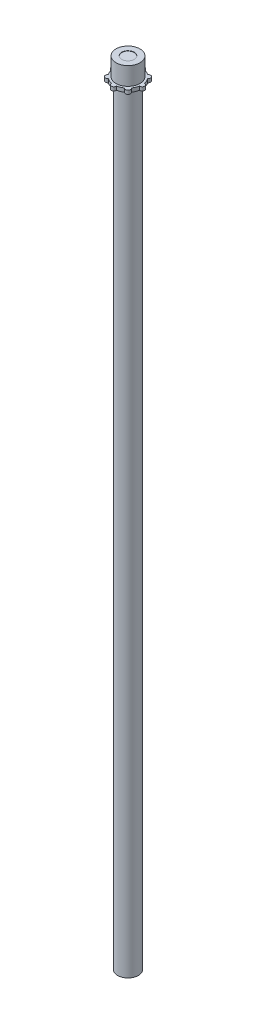
ISO-10303-21;
HEADER;
FILE_DESCRIPTION(('STEP AP214'),'2;1');
FILE_NAME('part.step','',(''),(''),'','','');
FILE_SCHEMA(('AUTOMOTIVE_DESIGN { 1 0 10303 214 1 1 1 1 }'));
ENDSEC;
DATA;
#1=APPLICATION_CONTEXT('core data for automotive mechanical design processes');
#2=APPLICATION_PROTOCOL_DEFINITION('international standard','automotive_design',2000,#1);
#3=PRODUCT_CONTEXT('',#1,'mechanical');
#4=PRODUCT('Part','Part','',(#3));
#5=PRODUCT_RELATED_PRODUCT_CATEGORY('part','',(#4));
#6=PRODUCT_DEFINITION_FORMATION('','',#4);
#7=PRODUCT_DEFINITION_CONTEXT('part definition',#1,'design');
#8=PRODUCT_DEFINITION('design','',#6,#7);
#9=PRODUCT_DEFINITION_SHAPE('','',#8);
#10=(LENGTH_UNIT() NAMED_UNIT(*) SI_UNIT(.MILLI.,.METRE.));
#11=(NAMED_UNIT(*) PLANE_ANGLE_UNIT() SI_UNIT($,.RADIAN.));
#12=(NAMED_UNIT(*) SI_UNIT($,.STERADIAN.) SOLID_ANGLE_UNIT());
#13=UNCERTAINTY_MEASURE_WITH_UNIT(LENGTH_MEASURE(1.E-05),#10,'distance_accuracy_value','');
#14=(GEOMETRIC_REPRESENTATION_CONTEXT(3) GLOBAL_UNCERTAINTY_ASSIGNED_CONTEXT((#13)) GLOBAL_UNIT_ASSIGNED_CONTEXT((#10,
#11,#12)) REPRESENTATION_CONTEXT('',''));
#15=CARTESIAN_POINT('',(0.,0.,0.));
#16=DIRECTION('',(0.,0.,1.));
#17=DIRECTION('',(1.,0.,0.));
#18=AXIS2_PLACEMENT_3D('',#15,#16,#17);
#19=CARTESIAN_POINT('',(0.,586.74,0.));
#20=DIRECTION('',(0.,-1.,0.));
#21=DIRECTION('',(0.,0.,-1.));
#22=AXIS2_PLACEMENT_3D('',#19,#20,#21);
#23=CYLINDRICAL_SURFACE('',#22,7.874);
#24=CARTESIAN_POINT('',(0.,586.74,0.));
#25=DIRECTION('',(0.,1.,0.));
#26=DIRECTION('',(0.,0.,1.));
#27=AXIS2_PLACEMENT_3D('',#24,#25,#26);
#28=CIRCLE('',#27,7.874);
#29=CARTESIAN_POINT('',(0.,586.74,7.874));
#30=VERTEX_POINT('',#29);
#31=EDGE_CURVE('E48',#30,#30,#28,.T.);
#32=ORIENTED_EDGE('',*,*,#31,.F.);
#33=EDGE_LOOP('',(#32));
#34=FACE_BOUND('',#33,.T.);
#35=CARTESIAN_POINT('',(0.,0.,0.));
#36=DIRECTION('',(0.,1.,0.));
#37=DIRECTION('',(0.,0.,1.));
#38=AXIS2_PLACEMENT_3D('',#35,#36,#37);
#39=CIRCLE('',#38,7.874);
#40=CARTESIAN_POINT('',(0.,0.,7.874));
#41=VERTEX_POINT('',#40);
#42=EDGE_CURVE('E41',#41,#41,#39,.T.);
#43=ORIENTED_EDGE('',*,*,#42,.T.);
#44=EDGE_LOOP('',(#43));
#45=FACE_BOUND('',#44,.T.);
#46=ADVANCED_FACE('F38',(#34,#45),#23,.T.);
#47=CARTESIAN_POINT('',(0.,0.,0.));
#48=DIRECTION('',(0.,1.,0.));
#49=DIRECTION('',(0.,0.,1.));
#50=AXIS2_PLACEMENT_3D('',#47,#48,#49);
#51=PLANE('',#50);
#52=ORIENTED_EDGE('',*,*,#42,.F.);
#53=EDGE_LOOP('',(#52));
#54=FACE_BOUND('',#53,.T.);
#55=ADVANCED_FACE('F299',(#54),#51,.F.);
#56=CARTESIAN_POINT('',(0.,589.534,0.));
#57=DIRECTION('',(0.,-1.,0.));
#58=DIRECTION('',(0.,0.,-1.));
#59=AXIS2_PLACEMENT_3D('',#56,#57,#58);
#60=CYLINDRICAL_SURFACE('',#59,10.795);
#61=CARTESIAN_POINT('',(0.,586.74,0.));
#62=DIRECTION('',(0.,1.,0.));
#63=DIRECTION('',(0.,0.,1.));
#64=AXIS2_PLACEMENT_3D('',#61,#62,#63);
#65=CIRCLE('',#64,10.795);
#66=CARTESIAN_POINT('',(-1.89756985251066,586.74,-10.6269117647058));
#67=VERTEX_POINT('',#66);
#68=CARTESIAN_POINT('',(-6.17257686140914,586.74,-8.85614588238002));
#69=VERTEX_POINT('',#68);
#70=EDGE_CURVE('E190',#67,#69,#65,.T.);
#71=ORIENTED_EDGE('',*,*,#70,.T.);
#72=DIRECTION('',(0.,-1.,0.));
#73=VECTOR('',#72,1.);
#74=CARTESIAN_POINT('',(-6.17257686140914,589.534,-8.85614588238002));
#75=LINE('',#74,#73);
#76=CARTESIAN_POINT('',(-6.17257686140914,589.534,-8.85614588238002));
#77=VERTEX_POINT('',#76);
#78=EDGE_CURVE('E288',#77,#69,#75,.T.);
#79=ORIENTED_EDGE('',*,*,#78,.F.);
#80=CARTESIAN_POINT('',(0.,589.534,0.));
#81=DIRECTION('',(0.,1.,0.));
#82=DIRECTION('',(0.,0.,1.));
#83=AXIS2_PLACEMENT_3D('',#80,#81,#82);
#84=CIRCLE('',#83,10.795);
#85=CARTESIAN_POINT('',(-1.89756985251066,589.534,-10.6269117647058));
#86=VERTEX_POINT('',#85);
#87=EDGE_CURVE('E237',#86,#77,#84,.T.);
#88=ORIENTED_EDGE('',*,*,#87,.F.);
#89=DIRECTION('',(0.,-1.,0.));
#90=VECTOR('',#89,1.);
#91=CARTESIAN_POINT('',(-1.89756985251066,589.534,-10.6269117647058));
#92=LINE('',#91,#90);
#93=EDGE_CURVE('E186',#86,#67,#92,.T.);
#94=ORIENTED_EDGE('',*,*,#93,.T.);
#95=EDGE_LOOP('',(#71,#79,#88,#94));
#96=FACE_BOUND('',#95,.T.);
#97=ADVANCED_FACE('F301',(#96),#60,.T.);
#98=CARTESIAN_POINT('',(-7.63321770290878,589.534,-7.63321770290878));
#99=DIRECTION('',(0.,-1.,0.));
#100=DIRECTION('',(0.,0.,-1.));
#101=AXIS2_PLACEMENT_3D('',#98,#99,#100);
#102=CYLINDRICAL_SURFACE('',#101,1.90500000000043);
#103=CARTESIAN_POINT('',(-7.63321770290878,586.74,-7.63321770290878));
#104=DIRECTION('',(0.,1.,0.));
#105=DIRECTION('',(0.,0.,1.));
#106=AXIS2_PLACEMENT_3D('',#103,#104,#105);
#107=CIRCLE('',#106,1.90500000000043);
#108=CARTESIAN_POINT('',(-8.85614588238002,586.74,-6.17257686140913));
#109=VERTEX_POINT('',#108);
#110=EDGE_CURVE('E194',#69,#109,#107,.T.);
#111=ORIENTED_EDGE('',*,*,#110,.T.);
#112=DIRECTION('',(0.,-1.,0.));
#113=VECTOR('',#112,1.);
#114=CARTESIAN_POINT('',(-8.85614588238002,589.534,-6.17257686140913));
#115=LINE('',#114,#113);
#116=CARTESIAN_POINT('',(-8.85614588238002,589.534,-6.17257686140913));
#117=VERTEX_POINT('',#116);
#118=EDGE_CURVE('E284',#117,#109,#115,.T.);
#119=ORIENTED_EDGE('',*,*,#118,.F.);
#120=CARTESIAN_POINT('',(-7.63321770290878,589.534,-7.63321770290878));
#121=DIRECTION('',(0.,1.,0.));
#122=DIRECTION('',(0.,0.,1.));
#123=AXIS2_PLACEMENT_3D('',#120,#121,#122);
#124=CIRCLE('',#123,1.90500000000043);
#125=EDGE_CURVE('E125',#77,#117,#124,.T.);
#126=ORIENTED_EDGE('',*,*,#125,.F.);
#127=ORIENTED_EDGE('',*,*,#78,.T.);
#128=EDGE_LOOP('',(#111,#119,#126,#127));
#129=FACE_BOUND('',#128,.T.);
#130=ADVANCED_FACE('F306',(#129),#102,.T.);
#131=CARTESIAN_POINT('',(0.,589.534,0.));
#132=DIRECTION('',(0.,-1.,0.));
#133=DIRECTION('',(0.,0.,-1.));
#134=AXIS2_PLACEMENT_3D('',#131,#132,#133);
#135=CYLINDRICAL_SURFACE('',#134,10.795);
#136=CARTESIAN_POINT('',(0.,586.74,0.));
#137=DIRECTION('',(0.,1.,0.));
#138=DIRECTION('',(0.,0.,1.));
#139=AXIS2_PLACEMENT_3D('',#136,#137,#138);
#140=CIRCLE('',#139,10.795);
#141=CARTESIAN_POINT('',(-10.6269117647058,586.74,-1.89756985251058));
#142=VERTEX_POINT('',#141);
#143=EDGE_CURVE('E198',#109,#142,#140,.T.);
#144=ORIENTED_EDGE('',*,*,#143,.T.);
#145=DIRECTION('',(0.,-1.,0.));
#146=VECTOR('',#145,1.);
#147=CARTESIAN_POINT('',(-10.6269117647058,589.534,-1.89756985251058));
#148=LINE('',#147,#146);
#149=CARTESIAN_POINT('',(-10.6269117647058,589.534,-1.89756985251058));
#150=VERTEX_POINT('',#149);
#151=EDGE_CURVE('E280',#150,#142,#148,.T.);
#152=ORIENTED_EDGE('',*,*,#151,.F.);
#153=CARTESIAN_POINT('',(0.,589.534,0.));
#154=DIRECTION('',(0.,1.,0.));
#155=DIRECTION('',(0.,0.,1.));
#156=AXIS2_PLACEMENT_3D('',#153,#154,#155);
#157=CIRCLE('',#156,10.795);
#158=EDGE_CURVE('E404',#117,#150,#157,.T.);
#159=ORIENTED_EDGE('',*,*,#158,.F.);
#160=ORIENTED_EDGE('',*,*,#118,.T.);
#161=EDGE_LOOP('',(#144,#152,#159,#160));
#162=FACE_BOUND('',#161,.T.);
#163=ADVANCED_FACE('F313',(#162),#135,.T.);
#164=CARTESIAN_POINT('',(-10.795,589.534,0.));
#165=DIRECTION('',(0.,-1.,0.));
#166=DIRECTION('',(0.,0.,-1.));
#167=AXIS2_PLACEMENT_3D('',#164,#165,#166);
#168=CYLINDRICAL_SURFACE('',#167,1.90500000000035);
#169=CARTESIAN_POINT('',(-10.795,586.74,0.));
#170=DIRECTION('',(0.,1.,0.));
#171=DIRECTION('',(0.,0.,1.));
#172=AXIS2_PLACEMENT_3D('',#169,#170,#171);
#173=CIRCLE('',#172,1.90500000000035);
#174=CARTESIAN_POINT('',(-10.6269117647058,586.74,1.89756985251067));
#175=VERTEX_POINT('',#174);
#176=EDGE_CURVE('E201',#142,#175,#173,.T.);
#177=ORIENTED_EDGE('',*,*,#176,.T.);
#178=DIRECTION('',(0.,-1.,0.));
#179=VECTOR('',#178,1.);
#180=CARTESIAN_POINT('',(-10.6269117647058,589.534,1.89756985251067));
#181=LINE('',#180,#179);
#182=CARTESIAN_POINT('',(-10.6269117647058,589.534,1.89756985251067));
#183=VERTEX_POINT('',#182);
#184=EDGE_CURVE('E276',#183,#175,#181,.T.);
#185=ORIENTED_EDGE('',*,*,#184,.F.);
#186=CARTESIAN_POINT('',(-10.795,589.534,0.));
#187=DIRECTION('',(0.,1.,0.));
#188=DIRECTION('',(0.,0.,1.));
#189=AXIS2_PLACEMENT_3D('',#186,#187,#188);
#190=CIRCLE('',#189,1.90500000000035);
#191=EDGE_CURVE('E407',#150,#183,#190,.T.);
#192=ORIENTED_EDGE('',*,*,#191,.F.);
#193=ORIENTED_EDGE('',*,*,#151,.T.);
#194=EDGE_LOOP('',(#177,#185,#192,#193));
#195=FACE_BOUND('',#194,.T.);
#196=ADVANCED_FACE('F316',(#195),#168,.T.);
#197=CARTESIAN_POINT('',(0.,589.534,0.));
#198=DIRECTION('',(0.,-1.,0.));
#199=DIRECTION('',(0.,0.,-1.));
#200=AXIS2_PLACEMENT_3D('',#197,#198,#199);
#201=CYLINDRICAL_SURFACE('',#200,10.795);
#202=CARTESIAN_POINT('',(0.,586.74,0.));
#203=DIRECTION('',(0.,1.,0.));
#204=DIRECTION('',(0.,0.,1.));
#205=AXIS2_PLACEMENT_3D('',#202,#203,#204);
#206=CIRCLE('',#205,10.795);
#207=CARTESIAN_POINT('',(-8.85614588237996,586.74,6.17257686140924));
#208=VERTEX_POINT('',#207);
#209=EDGE_CURVE('E204',#175,#208,#206,.T.);
#210=ORIENTED_EDGE('',*,*,#209,.T.);
#211=DIRECTION('',(0.,-1.,0.));
#212=VECTOR('',#211,1.);
#213=CARTESIAN_POINT('',(-8.85614588237996,589.534,6.17257686140924));
#214=LINE('',#213,#212);
#215=CARTESIAN_POINT('',(-8.85614588237996,589.534,6.17257686140924));
#216=VERTEX_POINT('',#215);
#217=EDGE_CURVE('E272',#216,#208,#214,.T.);
#218=ORIENTED_EDGE('',*,*,#217,.F.);
#219=CARTESIAN_POINT('',(0.,589.534,0.));
#220=DIRECTION('',(0.,1.,0.));
#221=DIRECTION('',(0.,0.,1.));
#222=AXIS2_PLACEMENT_3D('',#219,#220,#221);
#223=CIRCLE('',#222,10.795);
#224=EDGE_CURVE('E410',#183,#216,#223,.T.);
#225=ORIENTED_EDGE('',*,*,#224,.F.);
#226=ORIENTED_EDGE('',*,*,#184,.T.);
#227=EDGE_LOOP('',(#210,#218,#225,#226));
#228=FACE_BOUND('',#227,.T.);
#229=ADVANCED_FACE('F320',(#228),#201,.T.);
#230=CARTESIAN_POINT('',(-7.63321770290878,589.534,7.63321770290878));
#231=DIRECTION('',(0.,-1.,0.));
#232=DIRECTION('',(0.,0.,-1.));
#233=AXIS2_PLACEMENT_3D('',#230,#231,#232);
#234=CYLINDRICAL_SURFACE('',#233,1.90500000000031);
#235=CARTESIAN_POINT('',(-7.63321770290878,586.74,7.63321770290878));
#236=DIRECTION('',(0.,1.,0.));
#237=DIRECTION('',(0.,0.,1.));
#238=AXIS2_PLACEMENT_3D('',#235,#236,#237);
#239=CIRCLE('',#238,1.90500000000031);
#240=CARTESIAN_POINT('',(-6.17257686140913,586.74,8.85614588238002));
#241=VERTEX_POINT('',#240);
#242=EDGE_CURVE('E207',#208,#241,#239,.T.);
#243=ORIENTED_EDGE('',*,*,#242,.T.);
#244=DIRECTION('',(0.,-1.,0.));
#245=VECTOR('',#244,1.);
#246=CARTESIAN_POINT('',(-6.17257686140913,589.534,8.85614588238002));
#247=LINE('',#246,#245);
#248=CARTESIAN_POINT('',(-6.17257686140913,589.534,8.85614588238002));
#249=VERTEX_POINT('',#248);
#250=EDGE_CURVE('E268',#249,#241,#247,.T.);
#251=ORIENTED_EDGE('',*,*,#250,.F.);
#252=CARTESIAN_POINT('',(-7.63321770290878,589.534,7.63321770290878));
#253=DIRECTION('',(0.,1.,0.));
#254=DIRECTION('',(0.,0.,1.));
#255=AXIS2_PLACEMENT_3D('',#252,#253,#254);
#256=CIRCLE('',#255,1.90500000000031);
#257=EDGE_CURVE('E413',#216,#249,#256,.T.);
#258=ORIENTED_EDGE('',*,*,#257,.F.);
#259=ORIENTED_EDGE('',*,*,#217,.T.);
#260=EDGE_LOOP('',(#243,#251,#258,#259));
#261=FACE_BOUND('',#260,.T.);
#262=ADVANCED_FACE('F324',(#261),#234,.T.);
#263=CARTESIAN_POINT('',(0.,589.534,0.));
#264=DIRECTION('',(0.,-1.,0.));
#265=DIRECTION('',(0.,0.,-1.));
#266=AXIS2_PLACEMENT_3D('',#263,#264,#265);
#267=CYLINDRICAL_SURFACE('',#266,10.795);
#268=CARTESIAN_POINT('',(0.,586.74,0.));
#269=DIRECTION('',(0.,1.,0.));
#270=DIRECTION('',(0.,0.,1.));
#271=AXIS2_PLACEMENT_3D('',#268,#269,#270);
#272=CIRCLE('',#271,10.795);
#273=CARTESIAN_POINT('',(-1.89756985251066,586.74,10.6269117647058));
#274=VERTEX_POINT('',#273);
#275=EDGE_CURVE('E210',#241,#274,#272,.T.);
#276=ORIENTED_EDGE('',*,*,#275,.T.);
#277=DIRECTION('',(0.,-1.,0.));
#278=VECTOR('',#277,1.);
#279=CARTESIAN_POINT('',(-1.89756985251066,589.534,10.6269117647058));
#280=LINE('',#279,#278);
#281=CARTESIAN_POINT('',(-1.89756985251066,589.534,10.6269117647058));
#282=VERTEX_POINT('',#281);
#283=EDGE_CURVE('E264',#282,#274,#280,.T.);
#284=ORIENTED_EDGE('',*,*,#283,.F.);
#285=CARTESIAN_POINT('',(0.,589.534,0.));
#286=DIRECTION('',(0.,1.,0.));
#287=DIRECTION('',(0.,0.,1.));
#288=AXIS2_PLACEMENT_3D('',#285,#286,#287);
#289=CIRCLE('',#288,10.795);
#290=EDGE_CURVE('E416',#249,#282,#289,.T.);
#291=ORIENTED_EDGE('',*,*,#290,.F.);
#292=ORIENTED_EDGE('',*,*,#250,.T.);
#293=EDGE_LOOP('',(#276,#284,#291,#292));
#294=FACE_BOUND('',#293,.T.);
#295=ADVANCED_FACE('F328',(#294),#267,.T.);
#296=CARTESIAN_POINT('',(0.,589.534,10.795));
#297=DIRECTION('',(0.,-1.,0.));
#298=DIRECTION('',(0.,0.,-1.));
#299=AXIS2_PLACEMENT_3D('',#296,#297,#298);
#300=CYLINDRICAL_SURFACE('',#299,1.90500000000043);
#301=CARTESIAN_POINT('',(0.,586.74,10.795));
#302=DIRECTION('',(0.,1.,0.));
#303=DIRECTION('',(0.,0.,1.));
#304=AXIS2_PLACEMENT_3D('',#301,#302,#303);
#305=CIRCLE('',#304,1.90500000000043);
#306=CARTESIAN_POINT('',(1.89756985251066,586.74,10.6269117647058));
#307=VERTEX_POINT('',#306);
#308=EDGE_CURVE('E213',#274,#307,#305,.T.);
#309=ORIENTED_EDGE('',*,*,#308,.T.);
#310=DIRECTION('',(0.,-1.,0.));
#311=VECTOR('',#310,1.);
#312=CARTESIAN_POINT('',(1.89756985251066,589.534,10.6269117647058));
#313=LINE('',#312,#311);
#314=CARTESIAN_POINT('',(1.89756985251066,589.534,10.6269117647058));
#315=VERTEX_POINT('',#314);
#316=EDGE_CURVE('E260',#315,#307,#313,.T.);
#317=ORIENTED_EDGE('',*,*,#316,.F.);
#318=CARTESIAN_POINT('',(0.,589.534,10.795));
#319=DIRECTION('',(0.,1.,0.));
#320=DIRECTION('',(0.,0.,1.));
#321=AXIS2_PLACEMENT_3D('',#318,#319,#320);
#322=CIRCLE('',#321,1.90500000000043);
#323=EDGE_CURVE('E419',#282,#315,#322,.T.);
#324=ORIENTED_EDGE('',*,*,#323,.F.);
#325=ORIENTED_EDGE('',*,*,#283,.T.);
#326=EDGE_LOOP('',(#309,#317,#324,#325));
#327=FACE_BOUND('',#326,.T.);
#328=ADVANCED_FACE('F332',(#327),#300,.T.);
#329=CARTESIAN_POINT('',(0.,589.534,0.));
#330=DIRECTION('',(0.,-1.,0.));
#331=DIRECTION('',(0.,0.,-1.));
#332=AXIS2_PLACEMENT_3D('',#329,#330,#331);
#333=CYLINDRICAL_SURFACE('',#332,10.795);
#334=CARTESIAN_POINT('',(0.,586.74,0.));
#335=DIRECTION('',(0.,1.,0.));
#336=DIRECTION('',(0.,0.,1.));
#337=AXIS2_PLACEMENT_3D('',#334,#335,#336);
#338=CIRCLE('',#337,10.795);
#339=CARTESIAN_POINT('',(6.17257686140913,586.74,8.85614588238002));
#340=VERTEX_POINT('',#339);
#341=EDGE_CURVE('E216',#307,#340,#338,.T.);
#342=ORIENTED_EDGE('',*,*,#341,.T.);
#343=DIRECTION('',(0.,-1.,0.));
#344=VECTOR('',#343,1.);
#345=CARTESIAN_POINT('',(6.17257686140913,589.534,8.85614588238002));
#346=LINE('',#345,#344);
#347=CARTESIAN_POINT('',(6.17257686140913,589.534,8.85614588238002));
#348=VERTEX_POINT('',#347);
#349=EDGE_CURVE('E256',#348,#340,#346,.T.);
#350=ORIENTED_EDGE('',*,*,#349,.F.);
#351=CARTESIAN_POINT('',(0.,589.534,0.));
#352=DIRECTION('',(0.,1.,0.));
#353=DIRECTION('',(0.,0.,1.));
#354=AXIS2_PLACEMENT_3D('',#351,#352,#353);
#355=CIRCLE('',#354,10.795);
#356=EDGE_CURVE('E422',#315,#348,#355,.T.);
#357=ORIENTED_EDGE('',*,*,#356,.F.);
#358=ORIENTED_EDGE('',*,*,#316,.T.);
#359=EDGE_LOOP('',(#342,#350,#357,#358));
#360=FACE_BOUND('',#359,.T.);
#361=ADVANCED_FACE('F336',(#360),#333,.T.);
#362=CARTESIAN_POINT('',(7.63321770290878,589.534,7.63321770290878));
#363=DIRECTION('',(0.,-1.,0.));
#364=DIRECTION('',(0.,0.,-1.));
#365=AXIS2_PLACEMENT_3D('',#362,#363,#364);
#366=CYLINDRICAL_SURFACE('',#365,1.90500000000043);
#367=CARTESIAN_POINT('',(7.63321770290878,586.74,7.63321770290878));
#368=DIRECTION('',(0.,1.,0.));
#369=DIRECTION('',(0.,0.,1.));
#370=AXIS2_PLACEMENT_3D('',#367,#368,#369);
#371=CIRCLE('',#370,1.90500000000043);
#372=CARTESIAN_POINT('',(8.85614588238002,586.74,6.17257686140914));
#373=VERTEX_POINT('',#372);
#374=EDGE_CURVE('E219',#340,#373,#371,.T.);
#375=ORIENTED_EDGE('',*,*,#374,.T.);
#376=DIRECTION('',(0.,-1.,0.));
#377=VECTOR('',#376,1.);
#378=CARTESIAN_POINT('',(8.85614588238002,589.534,6.17257686140914));
#379=LINE('',#378,#377);
#380=CARTESIAN_POINT('',(8.85614588238002,589.534,6.17257686140914));
#381=VERTEX_POINT('',#380);
#382=EDGE_CURVE('E252',#381,#373,#379,.T.);
#383=ORIENTED_EDGE('',*,*,#382,.F.);
#384=CARTESIAN_POINT('',(7.63321770290878,589.534,7.63321770290878));
#385=DIRECTION('',(0.,1.,0.));
#386=DIRECTION('',(0.,0.,1.));
#387=AXIS2_PLACEMENT_3D('',#384,#385,#386);
#388=CIRCLE('',#387,1.90500000000043);
#389=EDGE_CURVE('E425',#348,#381,#388,.T.);
#390=ORIENTED_EDGE('',*,*,#389,.F.);
#391=ORIENTED_EDGE('',*,*,#349,.T.);
#392=EDGE_LOOP('',(#375,#383,#390,#391));
#393=FACE_BOUND('',#392,.T.);
#394=ADVANCED_FACE('F340',(#393),#366,.T.);
#395=CARTESIAN_POINT('',(0.,589.534,0.));
#396=DIRECTION('',(0.,-1.,0.));
#397=DIRECTION('',(0.,0.,-1.));
#398=AXIS2_PLACEMENT_3D('',#395,#396,#397);
#399=CYLINDRICAL_SURFACE('',#398,10.795);
#400=CARTESIAN_POINT('',(0.,586.74,0.));
#401=DIRECTION('',(0.,1.,0.));
#402=DIRECTION('',(0.,0.,1.));
#403=AXIS2_PLACEMENT_3D('',#400,#401,#402);
#404=CIRCLE('',#403,10.795);
#405=CARTESIAN_POINT('',(10.6269117647058,586.74,1.89756985251066));
#406=VERTEX_POINT('',#405);
#407=EDGE_CURVE('E222',#373,#406,#404,.T.);
#408=ORIENTED_EDGE('',*,*,#407,.T.);
#409=DIRECTION('',(0.,-1.,0.));
#410=VECTOR('',#409,1.);
#411=CARTESIAN_POINT('',(10.6269117647058,589.534,1.89756985251066));
#412=LINE('',#411,#410);
#413=CARTESIAN_POINT('',(10.6269117647058,589.534,1.89756985251066));
#414=VERTEX_POINT('',#413);
#415=EDGE_CURVE('E248',#414,#406,#412,.T.);
#416=ORIENTED_EDGE('',*,*,#415,.F.);
#417=CARTESIAN_POINT('',(0.,589.534,0.));
#418=DIRECTION('',(0.,1.,0.));
#419=DIRECTION('',(0.,0.,1.));
#420=AXIS2_PLACEMENT_3D('',#417,#418,#419);
#421=CIRCLE('',#420,10.795);
#422=EDGE_CURVE('E428',#381,#414,#421,.T.);
#423=ORIENTED_EDGE('',*,*,#422,.F.);
#424=ORIENTED_EDGE('',*,*,#382,.T.);
#425=EDGE_LOOP('',(#408,#416,#423,#424));
#426=FACE_BOUND('',#425,.T.);
#427=ADVANCED_FACE('F344',(#426),#399,.T.);
#428=CARTESIAN_POINT('',(10.795,589.534,0.));
#429=DIRECTION('',(0.,-1.,0.));
#430=DIRECTION('',(0.,0.,-1.));
#431=AXIS2_PLACEMENT_3D('',#428,#429,#430);
#432=CYLINDRICAL_SURFACE('',#431,1.90500000000044);
#433=CARTESIAN_POINT('',(10.795,586.74,0.));
#434=DIRECTION('',(0.,1.,0.));
#435=DIRECTION('',(0.,0.,1.));
#436=AXIS2_PLACEMENT_3D('',#433,#434,#435);
#437=CIRCLE('',#436,1.90500000000044);
#438=CARTESIAN_POINT('',(10.6269117647058,586.74,-1.89756985251067));
#439=VERTEX_POINT('',#438);
#440=EDGE_CURVE('E225',#406,#439,#437,.T.);
#441=ORIENTED_EDGE('',*,*,#440,.T.);
#442=DIRECTION('',(0.,-1.,0.));
#443=VECTOR('',#442,1.);
#444=CARTESIAN_POINT('',(10.6269117647058,589.534,-1.89756985251067));
#445=LINE('',#444,#443);
#446=CARTESIAN_POINT('',(10.6269117647058,589.534,-1.89756985251067));
#447=VERTEX_POINT('',#446);
#448=EDGE_CURVE('E244',#447,#439,#445,.T.);
#449=ORIENTED_EDGE('',*,*,#448,.F.);
#450=CARTESIAN_POINT('',(10.795,589.534,0.));
#451=DIRECTION('',(0.,1.,0.));
#452=DIRECTION('',(0.,0.,1.));
#453=AXIS2_PLACEMENT_3D('',#450,#451,#452);
#454=CIRCLE('',#453,1.90500000000044);
#455=EDGE_CURVE('E431',#414,#447,#454,.T.);
#456=ORIENTED_EDGE('',*,*,#455,.F.);
#457=ORIENTED_EDGE('',*,*,#415,.T.);
#458=EDGE_LOOP('',(#441,#449,#456,#457));
#459=FACE_BOUND('',#458,.T.);
#460=ADVANCED_FACE('F348',(#459),#432,.T.);
#461=CARTESIAN_POINT('',(0.,589.534,0.));
#462=DIRECTION('',(0.,-1.,0.));
#463=DIRECTION('',(0.,0.,-1.));
#464=AXIS2_PLACEMENT_3D('',#461,#462,#463);
#465=CYLINDRICAL_SURFACE('',#464,10.795);
#466=CARTESIAN_POINT('',(0.,586.74,0.));
#467=DIRECTION('',(0.,1.,0.));
#468=DIRECTION('',(0.,0.,1.));
#469=AXIS2_PLACEMENT_3D('',#466,#467,#468);
#470=CIRCLE('',#469,10.795);
#471=CARTESIAN_POINT('',(8.85614588238002,586.74,-6.17257686140914));
#472=VERTEX_POINT('',#471);
#473=EDGE_CURVE('E228',#439,#472,#470,.T.);
#474=ORIENTED_EDGE('',*,*,#473,.T.);
#475=DIRECTION('',(0.,-1.,0.));
#476=VECTOR('',#475,1.);
#477=CARTESIAN_POINT('',(8.85614588238002,589.534,-6.17257686140914));
#478=LINE('',#477,#476);
#479=CARTESIAN_POINT('',(8.85614588238002,589.534,-6.17257686140914));
#480=VERTEX_POINT('',#479);
#481=EDGE_CURVE('E179',#480,#472,#478,.T.);
#482=ORIENTED_EDGE('',*,*,#481,.F.);
#483=CARTESIAN_POINT('',(0.,589.534,0.));
#484=DIRECTION('',(0.,1.,0.));
#485=DIRECTION('',(0.,0.,1.));
#486=AXIS2_PLACEMENT_3D('',#483,#484,#485);
#487=CIRCLE('',#486,10.795);
#488=EDGE_CURVE('E168',#447,#480,#487,.T.);
#489=ORIENTED_EDGE('',*,*,#488,.F.);
#490=ORIENTED_EDGE('',*,*,#448,.T.);
#491=EDGE_LOOP('',(#474,#482,#489,#490));
#492=FACE_BOUND('',#491,.T.);
#493=ADVANCED_FACE('F352',(#492),#465,.T.);
#494=CARTESIAN_POINT('',(7.63321770290878,589.534,-7.63321770290878));
#495=DIRECTION('',(0.,-1.,0.));
#496=DIRECTION('',(0.,0.,-1.));
#497=AXIS2_PLACEMENT_3D('',#494,#495,#496);
#498=CYLINDRICAL_SURFACE('',#497,1.90500000000043);
#499=CARTESIAN_POINT('',(7.63321770290878,586.74,-7.63321770290878));
#500=DIRECTION('',(0.,1.,0.));
#501=DIRECTION('',(0.,0.,1.));
#502=AXIS2_PLACEMENT_3D('',#499,#500,#501);
#503=CIRCLE('',#502,1.90500000000043);
#504=CARTESIAN_POINT('',(6.17257686140913,586.74,-8.85614588238002));
#505=VERTEX_POINT('',#504);
#506=EDGE_CURVE('E177',#472,#505,#503,.T.);
#507=ORIENTED_EDGE('',*,*,#506,.T.);
#508=DIRECTION('',(0.,-1.,0.));
#509=VECTOR('',#508,1.);
#510=CARTESIAN_POINT('',(6.17257686140913,589.534,-8.85614588238002));
#511=LINE('',#510,#509);
#512=CARTESIAN_POINT('',(6.17257686140913,589.534,-8.85614588238002));
#513=VERTEX_POINT('',#512);
#514=EDGE_CURVE('E174',#513,#505,#511,.T.);
#515=ORIENTED_EDGE('',*,*,#514,.F.);
#516=CARTESIAN_POINT('',(7.63321770290878,589.534,-7.63321770290878));
#517=DIRECTION('',(0.,1.,0.));
#518=DIRECTION('',(0.,0.,1.));
#519=AXIS2_PLACEMENT_3D('',#516,#517,#518);
#520=CIRCLE('',#519,1.90500000000043);
#521=EDGE_CURVE('E162',#480,#513,#520,.T.);
#522=ORIENTED_EDGE('',*,*,#521,.F.);
#523=ORIENTED_EDGE('',*,*,#481,.T.);
#524=EDGE_LOOP('',(#507,#515,#522,#523));
#525=FACE_BOUND('',#524,.T.);
#526=ADVANCED_FACE('F175',(#525),#498,.T.);
#527=CARTESIAN_POINT('',(0.,589.534,0.));
#528=DIRECTION('',(0.,-1.,0.));
#529=DIRECTION('',(0.,0.,-1.));
#530=AXIS2_PLACEMENT_3D('',#527,#528,#529);
#531=CYLINDRICAL_SURFACE('',#530,10.795);
#532=CARTESIAN_POINT('',(0.,586.74,0.));
#533=DIRECTION('',(0.,1.,0.));
#534=DIRECTION('',(0.,0.,1.));
#535=AXIS2_PLACEMENT_3D('',#532,#533,#534);
#536=CIRCLE('',#535,10.795);
#537=CARTESIAN_POINT('',(1.89756985251066,586.74,-10.6269117647058));
#538=VERTEX_POINT('',#537);
#539=EDGE_CURVE('E110',#505,#538,#536,.T.);
#540=ORIENTED_EDGE('',*,*,#539,.T.);
#541=DIRECTION('',(0.,-1.,0.));
#542=VECTOR('',#541,1.);
#543=CARTESIAN_POINT('',(1.89756985251066,589.534,-10.6269117647058));
#544=LINE('',#543,#542);
#545=CARTESIAN_POINT('',(1.89756985251066,589.534,-10.6269117647058));
#546=VERTEX_POINT('',#545);
#547=EDGE_CURVE('E180',#546,#538,#544,.T.);
#548=ORIENTED_EDGE('',*,*,#547,.F.);
#549=CARTESIAN_POINT('',(0.,589.534,0.));
#550=DIRECTION('',(0.,1.,0.));
#551=DIRECTION('',(0.,0.,1.));
#552=AXIS2_PLACEMENT_3D('',#549,#550,#551);
#553=CIRCLE('',#552,10.795);
#554=EDGE_CURVE('E166',#513,#546,#553,.T.);
#555=ORIENTED_EDGE('',*,*,#554,.F.);
#556=ORIENTED_EDGE('',*,*,#514,.T.);
#557=EDGE_LOOP('',(#540,#548,#555,#556));
#558=FACE_BOUND('',#557,.T.);
#559=ADVANCED_FACE('F182',(#558),#531,.T.);
#560=CARTESIAN_POINT('',(0.,589.534,-10.795));
#561=DIRECTION('',(0.,-1.,0.));
#562=DIRECTION('',(0.,0.,-1.));
#563=AXIS2_PLACEMENT_3D('',#560,#561,#562);
#564=CYLINDRICAL_SURFACE('',#563,1.90500000000043);
#565=CARTESIAN_POINT('',(0.,586.74,-10.795));
#566=DIRECTION('',(0.,1.,0.));
#567=DIRECTION('',(0.,0.,1.));
#568=AXIS2_PLACEMENT_3D('',#565,#566,#567);
#569=CIRCLE('',#568,1.90500000000043);
#570=EDGE_CURVE('E116',#538,#67,#569,.T.);
#571=ORIENTED_EDGE('',*,*,#570,.T.);
#572=ORIENTED_EDGE('',*,*,#93,.F.);
#573=CARTESIAN_POINT('',(0.,589.534,-10.795));
#574=DIRECTION('',(0.,1.,0.));
#575=DIRECTION('',(0.,0.,1.));
#576=AXIS2_PLACEMENT_3D('',#573,#574,#575);
#577=CIRCLE('',#576,1.90500000000043);
#578=EDGE_CURVE('E57',#546,#86,#577,.T.);
#579=ORIENTED_EDGE('',*,*,#578,.F.);
#580=ORIENTED_EDGE('',*,*,#547,.T.);
#581=EDGE_LOOP('',(#571,#572,#579,#580));
#582=FACE_BOUND('',#581,.T.);
#583=ADVANCED_FACE('F361',(#582),#564,.T.);
#584=CARTESIAN_POINT('',(-3.81660885145439,589.534,-3.81660885145439));
#585=DIRECTION('',(0.,1.,0.));
#586=DIRECTION('',(0.,0.,1.));
#587=AXIS2_PLACEMENT_3D('',#584,#585,#586);
#588=PLANE('',#587);
#589=CARTESIAN_POINT('',(0.,589.534,0.));
#590=DIRECTION('',(0.,1.,0.));
#591=DIRECTION('',(0.,0.,1.));
#592=AXIS2_PLACEMENT_3D('',#589,#590,#591);
#593=CIRCLE('',#592,9.144);
#594=CARTESIAN_POINT('',(0.,589.534,9.144));
#595=VERTEX_POINT('',#594);
#596=EDGE_CURVE('E11',#595,#595,#593,.T.);
#597=ORIENTED_EDGE('',*,*,#596,.F.);
#598=EDGE_LOOP('',(#597));
#599=FACE_BOUND('',#598,.T.);
#600=ORIENTED_EDGE('',*,*,#87,.T.);
#601=ORIENTED_EDGE('',*,*,#125,.T.);
#602=ORIENTED_EDGE('',*,*,#158,.T.);
#603=ORIENTED_EDGE('',*,*,#191,.T.);
#604=ORIENTED_EDGE('',*,*,#224,.T.);
#605=ORIENTED_EDGE('',*,*,#257,.T.);
#606=ORIENTED_EDGE('',*,*,#290,.T.);
#607=ORIENTED_EDGE('',*,*,#323,.T.);
#608=ORIENTED_EDGE('',*,*,#356,.T.);
#609=ORIENTED_EDGE('',*,*,#389,.T.);
#610=ORIENTED_EDGE('',*,*,#422,.T.);
#611=ORIENTED_EDGE('',*,*,#455,.T.);
#612=ORIENTED_EDGE('',*,*,#488,.T.);
#613=ORIENTED_EDGE('',*,*,#521,.T.);
#614=ORIENTED_EDGE('',*,*,#554,.T.);
#615=ORIENTED_EDGE('',*,*,#578,.T.);
#616=EDGE_LOOP('',(#600,#601,#602,#603,#604,#605,#606,#607,#608,#609,#610,#611,#612,#613,#614,#615));
#617=FACE_BOUND('',#616,.T.);
#618=ADVANCED_FACE('F164',(#599,#617),#588,.T.);
#619=CARTESIAN_POINT('',(-3.81660885145439,586.74,-3.81660885145439));
#620=DIRECTION('',(0.,1.,0.));
#621=DIRECTION('',(0.,0.,1.));
#622=AXIS2_PLACEMENT_3D('',#619,#620,#621);
#623=PLANE('',#622);
#624=ORIENTED_EDGE('',*,*,#31,.T.);
#625=EDGE_LOOP('',(#624));
#626=FACE_BOUND('',#625,.T.);
#627=ORIENTED_EDGE('',*,*,#70,.F.);
#628=ORIENTED_EDGE('',*,*,#570,.F.);
#629=ORIENTED_EDGE('',*,*,#539,.F.);
#630=ORIENTED_EDGE('',*,*,#506,.F.);
#631=ORIENTED_EDGE('',*,*,#473,.F.);
#632=ORIENTED_EDGE('',*,*,#440,.F.);
#633=ORIENTED_EDGE('',*,*,#407,.F.);
#634=ORIENTED_EDGE('',*,*,#374,.F.);
#635=ORIENTED_EDGE('',*,*,#341,.F.);
#636=ORIENTED_EDGE('',*,*,#308,.F.);
#637=ORIENTED_EDGE('',*,*,#275,.F.);
#638=ORIENTED_EDGE('',*,*,#242,.F.);
#639=ORIENTED_EDGE('',*,*,#209,.F.);
#640=ORIENTED_EDGE('',*,*,#176,.F.);
#641=ORIENTED_EDGE('',*,*,#143,.F.);
#642=ORIENTED_EDGE('',*,*,#110,.F.);
#643=EDGE_LOOP('',(#627,#628,#629,#630,#631,#632,#633,#634,#635,#636,#637,#638,#639,#640,#641,#642));
#644=FACE_BOUND('',#643,.T.);
#645=ADVANCED_FACE('F364',(#626,#644),#623,.F.);
#646=CARTESIAN_POINT('',(0.,603.25,0.));
#647=DIRECTION('',(0.,-1.,0.));
#648=DIRECTION('',(0.,0.,-1.));
#649=AXIS2_PLACEMENT_3D('',#646,#647,#648);
#650=CYLINDRICAL_SURFACE('',#649,9.144);
#651=CARTESIAN_POINT('',(0.,603.25,0.));
#652=DIRECTION('',(0.,1.,0.));
#653=DIRECTION('',(0.,0.,1.));
#654=AXIS2_PLACEMENT_3D('',#651,#652,#653);
#655=CIRCLE('',#654,9.144);
#656=CARTESIAN_POINT('',(0.,603.25,9.144));
#657=VERTEX_POINT('',#656);
#658=EDGE_CURVE('E195',#657,#657,#655,.T.);
#659=ORIENTED_EDGE('',*,*,#658,.F.);
#660=EDGE_LOOP('',(#659));
#661=FACE_BOUND('',#660,.T.);
#662=ORIENTED_EDGE('',*,*,#596,.T.);
#663=EDGE_LOOP('',(#662));
#664=FACE_BOUND('',#663,.T.);
#665=ADVANCED_FACE('F367',(#661,#664),#650,.T.);
#666=CARTESIAN_POINT('',(0.,603.25,0.));
#667=DIRECTION('',(0.,1.,0.));
#668=DIRECTION('',(0.,0.,1.));
#669=AXIS2_PLACEMENT_3D('',#666,#667,#668);
#670=PLANE('',#669);
#671=CARTESIAN_POINT('',(0.,603.25,0.));
#672=DIRECTION('',(0.,1.,0.));
#673=DIRECTION('',(0.,0.,1.));
#674=AXIS2_PLACEMENT_3D('',#671,#672,#673);
#675=CIRCLE('',#674,4.7625);
#676=CARTESIAN_POINT('',(0.,603.25,4.7625));
#677=VERTEX_POINT('',#676);
#678=EDGE_CURVE('E391',#677,#677,#675,.T.);
#679=ORIENTED_EDGE('',*,*,#678,.F.);
#680=EDGE_LOOP('',(#679));
#681=FACE_BOUND('',#680,.T.);
#682=ORIENTED_EDGE('',*,*,#658,.T.);
#683=EDGE_LOOP('',(#682));
#684=FACE_BOUND('',#683,.T.);
#685=ADVANCED_FACE('F373',(#681,#684),#670,.T.);
#686=CARTESIAN_POINT('',(0.,602.996,0.));
#687=DIRECTION('',(0.,1.,0.));
#688=DIRECTION('',(0.,0.,1.));
#689=AXIS2_PLACEMENT_3D('',#686,#687,#688);
#690=CYLINDRICAL_SURFACE('',#689,4.7625);
#691=CARTESIAN_POINT('',(0.,602.996,0.));
#692=DIRECTION('',(0.,1.,0.));
#693=DIRECTION('',(0.,0.,1.));
#694=AXIS2_PLACEMENT_3D('',#691,#692,#693);
#695=CIRCLE('',#694,4.7625);
#696=CARTESIAN_POINT('',(0.,602.996,4.7625));
#697=VERTEX_POINT('',#696);
#698=EDGE_CURVE('E389',#697,#697,#695,.T.);
#699=ORIENTED_EDGE('',*,*,#698,.F.);
#700=EDGE_LOOP('',(#699));
#701=FACE_BOUND('',#700,.T.);
#702=ORIENTED_EDGE('',*,*,#678,.T.);
#703=EDGE_LOOP('',(#702));
#704=FACE_BOUND('',#703,.T.);
#705=ADVANCED_FACE('F377',(#701,#704),#690,.F.);
#706=CARTESIAN_POINT('',(0.,602.996,0.));
#707=DIRECTION('',(0.,1.,0.));
#708=DIRECTION('',(0.,0.,1.));
#709=AXIS2_PLACEMENT_3D('',#706,#707,#708);
#710=PLANE('',#709);
#711=ORIENTED_EDGE('',*,*,#698,.T.);
#712=EDGE_LOOP('',(#711));
#713=FACE_BOUND('',#712,.T.);
#714=ADVANCED_FACE('F381',(#713),#710,.T.);
#715=CLOSED_SHELL('',(#46,#55,#97,#130,#163,#196,#229,#262,#295,#328,#361,#394,#427,#460,#493,
#526,#559,#583,#618,#645,#665,#685,#705,#714));
#716=MANIFOLD_SOLID_BREP('B2',#715);
#717=ADVANCED_BREP_SHAPE_REPRESENTATION('',(#18,#716),#14);
#718=SHAPE_DEFINITION_REPRESENTATION(#9,#717);
ENDSEC;
END-ISO-10303-21;
